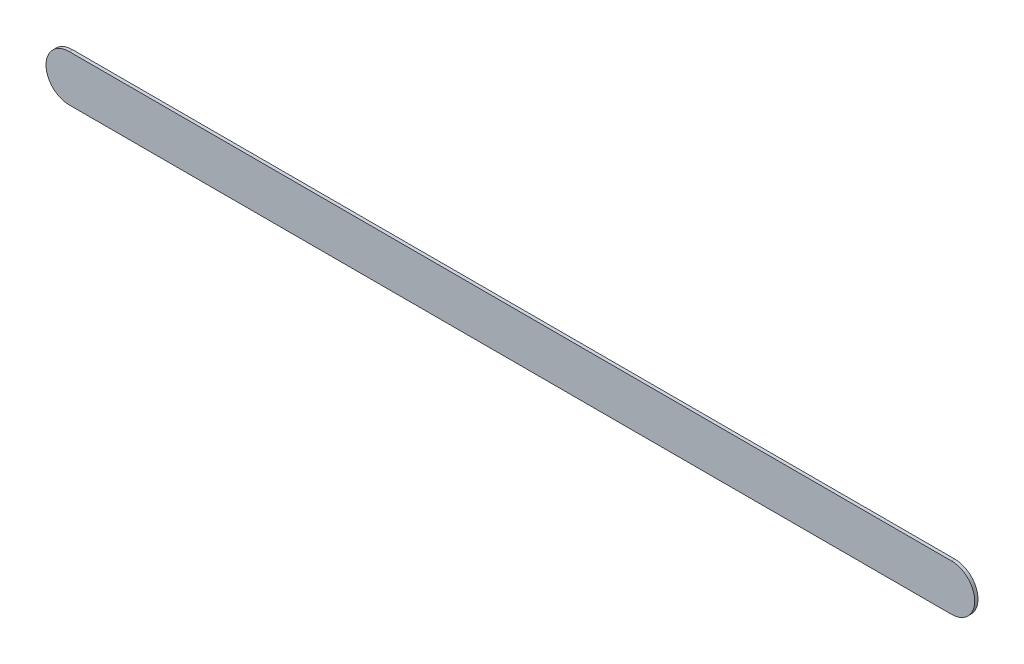
ISO-10303-21;
HEADER;
FILE_DESCRIPTION(('STEP AP214'),'2;1');
FILE_NAME('part.step','',(''),(''),'','','');
FILE_SCHEMA(('AUTOMOTIVE_DESIGN { 1 0 10303 214 1 1 1 1 }'));
ENDSEC;
DATA;
#1=APPLICATION_CONTEXT('core data for automotive mechanical design processes');
#2=APPLICATION_PROTOCOL_DEFINITION('international standard','automotive_design',2000,#1);
#3=PRODUCT_CONTEXT('',#1,'mechanical');
#4=PRODUCT('Part','Part','',(#3));
#5=PRODUCT_RELATED_PRODUCT_CATEGORY('part','',(#4));
#6=PRODUCT_DEFINITION_FORMATION('','',#4);
#7=PRODUCT_DEFINITION_CONTEXT('part definition',#1,'design');
#8=PRODUCT_DEFINITION('design','',#6,#7);
#9=PRODUCT_DEFINITION_SHAPE('','',#8);
#10=(LENGTH_UNIT() NAMED_UNIT(*) SI_UNIT(.MILLI.,.METRE.));
#11=(NAMED_UNIT(*) PLANE_ANGLE_UNIT() SI_UNIT($,.RADIAN.));
#12=(NAMED_UNIT(*) SI_UNIT($,.STERADIAN.) SOLID_ANGLE_UNIT());
#13=UNCERTAINTY_MEASURE_WITH_UNIT(LENGTH_MEASURE(1.E-05),#10,'distance_accuracy_value','');
#14=(GEOMETRIC_REPRESENTATION_CONTEXT(3) GLOBAL_UNCERTAINTY_ASSIGNED_CONTEXT((#13)) GLOBAL_UNIT_ASSIGNED_CONTEXT((#10,
#11,#12)) REPRESENTATION_CONTEXT('',''));
#15=CARTESIAN_POINT('',(0.,0.,0.));
#16=DIRECTION('',(0.,0.,1.));
#17=DIRECTION('',(1.,0.,0.));
#18=AXIS2_PLACEMENT_3D('',#15,#16,#17);
#19=CARTESIAN_POINT('',(85.40000192,67.75000166,0.));
#20=DIRECTION('',(0.,1.,0.));
#21=DIRECTION('',(1.,0.,0.));
#22=AXIS2_PLACEMENT_3D('',#19,#20,#21);
#23=PLANE('',#22);
#24=DIRECTION('',(1.,0.,0.));
#25=VECTOR('',#24,1.);
#26=CARTESIAN_POINT('',(85.40000192,67.75000166,0.03556));
#27=LINE('',#26,#25);
#28=CARTESIAN_POINT('',(85.40000192,67.75000166,0.03556));
#29=VERTEX_POINT('',#28);
#30=CARTESIAN_POINT('',(94.94079564,67.75000166,0.03556));
#31=VERTEX_POINT('',#30);
#32=EDGE_CURVE('E11',#29,#31,#27,.T.);
#33=ORIENTED_EDGE('',*,*,#32,.F.);
#34=DIRECTION('',(0.,0.,1.));
#35=VECTOR('',#34,1.);
#36=CARTESIAN_POINT('',(85.40000192,67.75000166,0.));
#37=LINE('',#36,#35);
#38=CARTESIAN_POINT('',(85.40000192,67.75000166,0.));
#39=VERTEX_POINT('',#38);
#40=EDGE_CURVE('E24',#39,#29,#37,.T.);
#41=ORIENTED_EDGE('',*,*,#40,.F.);
#42=DIRECTION('',(1.,0.,0.));
#43=VECTOR('',#42,1.);
#44=CARTESIAN_POINT('',(85.40000192,67.75000166,0.));
#45=LINE('',#44,#43);
#46=CARTESIAN_POINT('',(94.94079564,67.75000166,0.));
#47=VERTEX_POINT('',#46);
#48=EDGE_CURVE('E75',#39,#47,#45,.T.);
#49=ORIENTED_EDGE('',*,*,#48,.T.);
#50=DIRECTION('',(0.,0.,1.));
#51=VECTOR('',#50,1.);
#52=CARTESIAN_POINT('',(94.94079564,67.75000166,0.));
#53=LINE('',#52,#51);
#54=EDGE_CURVE('E37',#47,#31,#53,.T.);
#55=ORIENTED_EDGE('',*,*,#54,.T.);
#56=EDGE_LOOP('',(#33,#41,#49,#55));
#57=FACE_BOUND('',#56,.T.);
#58=ADVANCED_FACE('F17',(#57),#23,.F.);
#59=CARTESIAN_POINT('',(94.94079564,68.00000116,0.));
#60=DIRECTION('',(0.,0.,-1.));
#61=DIRECTION('',(0.,-1.,0.));
#62=AXIS2_PLACEMENT_3D('',#59,#60,#61);
#63=CYLINDRICAL_SURFACE('',#62,0.249999500000001);
#64=CARTESIAN_POINT('',(94.94079564,68.00000116,0.03556));
#65=DIRECTION('',(0.,0.,1.));
#66=DIRECTION('',(0.,-1.,0.));
#67=AXIS2_PLACEMENT_3D('',#64,#65,#66);
#68=CIRCLE('',#67,0.249999500000001);
#69=CARTESIAN_POINT('',(94.94079564,68.25000066,0.03556));
#70=VERTEX_POINT('',#69);
#71=EDGE_CURVE('E83',#31,#70,#68,.T.);
#72=ORIENTED_EDGE('',*,*,#71,.F.);
#73=ORIENTED_EDGE('',*,*,#54,.F.);
#74=CARTESIAN_POINT('',(94.94079564,68.00000116,0.));
#75=DIRECTION('',(0.,0.,1.));
#76=DIRECTION('',(0.,-1.,0.));
#77=AXIS2_PLACEMENT_3D('',#74,#75,#76);
#78=CIRCLE('',#77,0.249999500000001);
#79=CARTESIAN_POINT('',(94.94079564,68.25000066,0.));
#80=VERTEX_POINT('',#79);
#81=EDGE_CURVE('E81',#47,#80,#78,.T.);
#82=ORIENTED_EDGE('',*,*,#81,.T.);
#83=DIRECTION('',(0.,0.,1.));
#84=VECTOR('',#83,1.);
#85=CARTESIAN_POINT('',(94.94079564,68.25000066,0.));
#86=LINE('',#85,#84);
#87=EDGE_CURVE('E67',#80,#70,#86,.T.);
#88=ORIENTED_EDGE('',*,*,#87,.T.);
#89=EDGE_LOOP('',(#72,#73,#82,#88));
#90=FACE_BOUND('',#89,.T.);
#91=ADVANCED_FACE('F89',(#90),#63,.T.);
#92=CARTESIAN_POINT('',(94.94079564,68.25000066,0.));
#93=DIRECTION('',(0.,-1.,0.));
#94=DIRECTION('',(-1.,0.,0.));
#95=AXIS2_PLACEMENT_3D('',#92,#93,#94);
#96=PLANE('',#95);
#97=DIRECTION('',(-1.,0.,0.));
#98=VECTOR('',#97,1.);
#99=CARTESIAN_POINT('',(94.94079564,68.25000066,0.03556));
#100=LINE('',#99,#98);
#101=CARTESIAN_POINT('',(85.40000192,68.25000066,0.03556));
#102=VERTEX_POINT('',#101);
#103=EDGE_CURVE('E71',#70,#102,#100,.T.);
#104=ORIENTED_EDGE('',*,*,#103,.F.);
#105=ORIENTED_EDGE('',*,*,#87,.F.);
#106=DIRECTION('',(-1.,0.,0.));
#107=VECTOR('',#106,1.);
#108=CARTESIAN_POINT('',(94.94079564,68.25000066,0.));
#109=LINE('',#108,#107);
#110=CARTESIAN_POINT('',(85.40000192,68.25000066,0.));
#111=VERTEX_POINT('',#110);
#112=EDGE_CURVE('E63',#80,#111,#109,.T.);
#113=ORIENTED_EDGE('',*,*,#112,.T.);
#114=DIRECTION('',(0.,0.,1.));
#115=VECTOR('',#114,1.);
#116=CARTESIAN_POINT('',(85.40000192,68.25000066,0.));
#117=LINE('',#116,#115);
#118=EDGE_CURVE('E53',#111,#102,#117,.T.);
#119=ORIENTED_EDGE('',*,*,#118,.T.);
#120=EDGE_LOOP('',(#104,#105,#113,#119));
#121=FACE_BOUND('',#120,.T.);
#122=ADVANCED_FACE('F66',(#121),#96,.F.);
#123=CARTESIAN_POINT('',(85.40000192,68.00000116,0.));
#124=DIRECTION('',(0.,0.,-1.));
#125=DIRECTION('',(0.,1.,0.));
#126=AXIS2_PLACEMENT_3D('',#123,#124,#125);
#127=CYLINDRICAL_SURFACE('',#126,0.249999500000001);
#128=CARTESIAN_POINT('',(85.40000192,68.00000116,0.03556));
#129=DIRECTION('',(0.,0.,1.));
#130=DIRECTION('',(0.,1.,0.));
#131=AXIS2_PLACEMENT_3D('',#128,#129,#130);
#132=CIRCLE('',#131,0.249999500000001);
#133=EDGE_CURVE('E59',#102,#29,#132,.T.);
#134=ORIENTED_EDGE('',*,*,#133,.F.);
#135=ORIENTED_EDGE('',*,*,#118,.F.);
#136=CARTESIAN_POINT('',(85.40000192,68.00000116,0.));
#137=DIRECTION('',(0.,0.,1.));
#138=DIRECTION('',(0.,1.,0.));
#139=AXIS2_PLACEMENT_3D('',#136,#137,#138);
#140=CIRCLE('',#139,0.249999500000001);
#141=EDGE_CURVE('E57',#111,#39,#140,.T.);
#142=ORIENTED_EDGE('',*,*,#141,.T.);
#143=ORIENTED_EDGE('',*,*,#40,.T.);
#144=EDGE_LOOP('',(#134,#135,#142,#143));
#145=FACE_BOUND('',#144,.T.);
#146=ADVANCED_FACE('F55',(#145),#127,.T.);
#147=CARTESIAN_POINT('',(85.40000192,67.75000166,0.));
#148=DIRECTION('',(0.,0.,-1.));
#149=DIRECTION('',(-1.,0.,0.));
#150=AXIS2_PLACEMENT_3D('',#147,#148,#149);
#151=PLANE('',#150);
#152=ORIENTED_EDGE('',*,*,#141,.F.);
#153=ORIENTED_EDGE('',*,*,#112,.F.);
#154=ORIENTED_EDGE('',*,*,#81,.F.);
#155=ORIENTED_EDGE('',*,*,#48,.F.);
#156=EDGE_LOOP('',(#152,#153,#154,#155));
#157=FACE_BOUND('',#156,.T.);
#158=ADVANCED_FACE('F74',(#157),#151,.T.);
#159=CARTESIAN_POINT('',(85.40000192,67.75000166,0.03556));
#160=DIRECTION('',(0.,0.,-1.));
#161=DIRECTION('',(-1.,0.,0.));
#162=AXIS2_PLACEMENT_3D('',#159,#160,#161);
#163=PLANE('',#162);
#164=ORIENTED_EDGE('',*,*,#32,.T.);
#165=ORIENTED_EDGE('',*,*,#71,.T.);
#166=ORIENTED_EDGE('',*,*,#103,.T.);
#167=ORIENTED_EDGE('',*,*,#133,.T.);
#168=EDGE_LOOP('',(#164,#165,#166,#167));
#169=FACE_BOUND('',#168,.T.);
#170=ADVANCED_FACE('F91',(#169),#163,.F.);
#171=CLOSED_SHELL('',(#58,#91,#122,#146,#158,#170));
#172=MANIFOLD_SOLID_BREP('B1',#171);
#173=ADVANCED_BREP_SHAPE_REPRESENTATION('',(#18,#172),#14);
#174=SHAPE_DEFINITION_REPRESENTATION(#9,#173);
ENDSEC;
END-ISO-10303-21;
